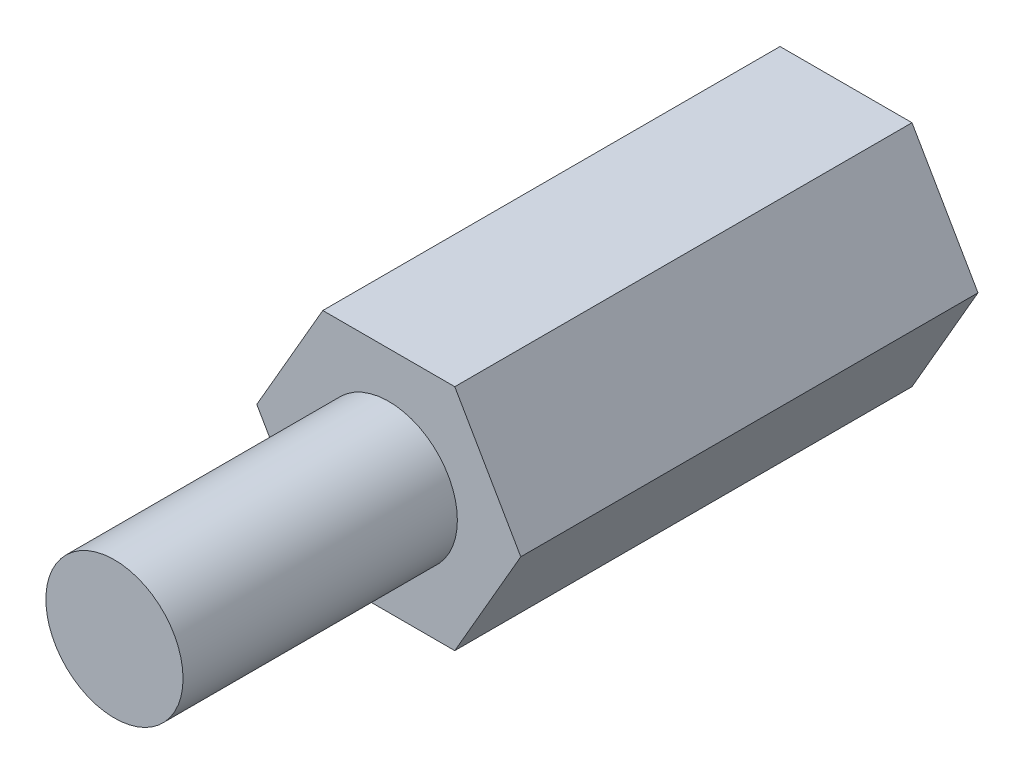
ISO-10303-21;
HEADER;
FILE_DESCRIPTION(('STEP AP214'),'2;1');
FILE_NAME('part.step','',(''),(''),'','','');
FILE_SCHEMA(('AUTOMOTIVE_DESIGN { 1 0 10303 214 1 1 1 1 }'));
ENDSEC;
DATA;
#1=APPLICATION_CONTEXT('core data for automotive mechanical design processes');
#2=APPLICATION_PROTOCOL_DEFINITION('international standard','automotive_design',2000,#1);
#3=PRODUCT_CONTEXT('',#1,'mechanical');
#4=PRODUCT('Part','Part','',(#3));
#5=PRODUCT_RELATED_PRODUCT_CATEGORY('part','',(#4));
#6=PRODUCT_DEFINITION_FORMATION('','',#4);
#7=PRODUCT_DEFINITION_CONTEXT('part definition',#1,'design');
#8=PRODUCT_DEFINITION('design','',#6,#7);
#9=PRODUCT_DEFINITION_SHAPE('','',#8);
#10=(LENGTH_UNIT() NAMED_UNIT(*) SI_UNIT(.MILLI.,.METRE.));
#11=(NAMED_UNIT(*) PLANE_ANGLE_UNIT() SI_UNIT($,.RADIAN.));
#12=(NAMED_UNIT(*) SI_UNIT($,.STERADIAN.) SOLID_ANGLE_UNIT());
#13=UNCERTAINTY_MEASURE_WITH_UNIT(LENGTH_MEASURE(1.E-05),#10,'distance_accuracy_value','');
#14=(GEOMETRIC_REPRESENTATION_CONTEXT(3) GLOBAL_UNCERTAINTY_ASSIGNED_CONTEXT((#13)) GLOBAL_UNIT_ASSIGNED_CONTEXT((#10,
#11,#12)) REPRESENTATION_CONTEXT('',''));
#15=CARTESIAN_POINT('',(0.,0.,0.));
#16=DIRECTION('',(0.,0.,1.));
#17=DIRECTION('',(1.,0.,0.));
#18=AXIS2_PLACEMENT_3D('',#15,#16,#17);
#19=CARTESIAN_POINT('',(1.44337567297407,-2.50000000000001,10.));
#20=DIRECTION('',(0.,0.,1.));
#21=DIRECTION('',(1.,0.,0.));
#22=AXIS2_PLACEMENT_3D('',#19,#20,#21);
#23=PLANE('',#22);
#24=DIRECTION('',(1.,0.,0.));
#25=VECTOR('',#24,1.);
#26=CARTESIAN_POINT('',(-1.44337567297407,-2.5,10.));
#27=LINE('',#26,#25);
#28=CARTESIAN_POINT('',(-1.44337567297407,-2.5,10.));
#29=VERTEX_POINT('',#28);
#30=CARTESIAN_POINT('',(1.44337567297406,-2.50000000000001,10.));
#31=VERTEX_POINT('',#30);
#32=EDGE_CURVE('E133',#29,#31,#27,.T.);
#33=ORIENTED_EDGE('',*,*,#32,.T.);
#34=DIRECTION('',(0.499999999999999,0.866025403784439,0.));
#35=VECTOR('',#34,1.);
#36=CARTESIAN_POINT('',(1.44337567297406,-2.50000000000001,10.));
#37=LINE('',#36,#35);
#38=CARTESIAN_POINT('',(2.88675134594814,0.,10.));
#39=VERTEX_POINT('',#38);
#40=EDGE_CURVE('E90',#31,#39,#37,.T.);
#41=ORIENTED_EDGE('',*,*,#40,.T.);
#42=DIRECTION('',(-0.5,0.866025403784439,0.));
#43=VECTOR('',#42,1.);
#44=CARTESIAN_POINT('',(2.88675134594814,0.,10.));
#45=LINE('',#44,#43);
#46=CARTESIAN_POINT('',(1.44337567297407,2.50000000000002,10.));
#47=VERTEX_POINT('',#46);
#48=EDGE_CURVE('E104',#39,#47,#45,.T.);
#49=ORIENTED_EDGE('',*,*,#48,.T.);
#50=DIRECTION('',(-1.,0.,0.));
#51=VECTOR('',#50,1.);
#52=CARTESIAN_POINT('',(1.44337567297407,2.50000000000002,10.));
#53=LINE('',#52,#51);
#54=CARTESIAN_POINT('',(-1.44337567297407,2.50000000000002,10.));
#55=VERTEX_POINT('',#54);
#56=EDGE_CURVE('E98',#47,#55,#53,.T.);
#57=ORIENTED_EDGE('',*,*,#56,.T.);
#58=DIRECTION('',(-0.500000000000001,-0.866025403784438,0.));
#59=VECTOR('',#58,1.);
#60=CARTESIAN_POINT('',(-1.44337567297407,2.50000000000002,10.));
#61=LINE('',#60,#59);
#62=CARTESIAN_POINT('',(-2.88675134594814,0.,10.));
#63=VERTEX_POINT('',#62);
#64=EDGE_CURVE('E102',#55,#63,#61,.T.);
#65=ORIENTED_EDGE('',*,*,#64,.T.);
#66=DIRECTION('',(0.5,-0.866025403784439,0.));
#67=VECTOR('',#66,1.);
#68=CARTESIAN_POINT('',(-2.88675134594814,0.,10.));
#69=LINE('',#68,#67);
#70=EDGE_CURVE('E52',#63,#29,#69,.T.);
#71=ORIENTED_EDGE('',*,*,#70,.T.);
#72=EDGE_LOOP('',(#33,#41,#49,#57,#65,#71));
#73=FACE_BOUND('',#72,.T.);
#74=CARTESIAN_POINT('',(0.,0.,10.));
#75=DIRECTION('',(0.,0.,1.));
#76=DIRECTION('',(1.,0.,0.));
#77=AXIS2_PLACEMENT_3D('',#74,#75,#76);
#78=CIRCLE('',#77,1.5);
#79=CARTESIAN_POINT('',(1.5,0.,10.));
#80=VERTEX_POINT('',#79);
#81=EDGE_CURVE('E188',#80,#80,#78,.T.);
#82=ORIENTED_EDGE('',*,*,#81,.F.);
#83=EDGE_LOOP('',(#82));
#84=FACE_BOUND('',#83,.T.);
#85=ADVANCED_FACE('F35',(#73,#84),#23,.T.);
#86=CARTESIAN_POINT('',(-1.44337567297407,-2.5,10.));
#87=DIRECTION('',(0.,1.,0.));
#88=DIRECTION('',(-1.,0.,0.));
#89=AXIS2_PLACEMENT_3D('',#86,#87,#88);
#90=PLANE('',#89);
#91=DIRECTION('',(1.,0.,0.));
#92=VECTOR('',#91,1.);
#93=CARTESIAN_POINT('',(-1.44337567297407,-2.5,0.));
#94=LINE('',#93,#92);
#95=CARTESIAN_POINT('',(-1.44337567297407,-2.5,0.));
#96=VERTEX_POINT('',#95);
#97=CARTESIAN_POINT('',(1.44337567297406,-2.50000000000001,0.));
#98=VERTEX_POINT('',#97);
#99=EDGE_CURVE('E122',#96,#98,#94,.T.);
#100=ORIENTED_EDGE('',*,*,#99,.T.);
#101=DIRECTION('',(0.,0.,-1.));
#102=VECTOR('',#101,1.);
#103=CARTESIAN_POINT('',(1.44337567297406,-2.50000000000001,10.));
#104=LINE('',#103,#102);
#105=EDGE_CURVE('E11',#31,#98,#104,.T.);
#106=ORIENTED_EDGE('',*,*,#105,.F.);
#107=ORIENTED_EDGE('',*,*,#32,.F.);
#108=DIRECTION('',(0.,0.,-1.));
#109=VECTOR('',#108,1.);
#110=CARTESIAN_POINT('',(-1.44337567297407,-2.5,10.));
#111=LINE('',#110,#109);
#112=EDGE_CURVE('E118',#29,#96,#111,.T.);
#113=ORIENTED_EDGE('',*,*,#112,.T.);
#114=EDGE_LOOP('',(#100,#106,#107,#113));
#115=FACE_BOUND('',#114,.T.);
#116=ADVANCED_FACE('F37',(#115),#90,.F.);
#117=CARTESIAN_POINT('',(1.44337567297406,-2.50000000000001,10.));
#118=DIRECTION('',(-0.866025403784439,0.499999999999999,0.));
#119=DIRECTION('',(-0.499999999999999,-0.866025403784439,0.));
#120=AXIS2_PLACEMENT_3D('',#117,#118,#119);
#121=PLANE('',#120);
#122=DIRECTION('',(0.499999999999999,0.866025403784439,0.));
#123=VECTOR('',#122,1.);
#124=CARTESIAN_POINT('',(1.44337567297406,-2.50000000000001,0.));
#125=LINE('',#124,#123);
#126=CARTESIAN_POINT('',(2.88675134594814,0.,0.));
#127=VERTEX_POINT('',#126);
#128=EDGE_CURVE('E125',#98,#127,#125,.T.);
#129=ORIENTED_EDGE('',*,*,#128,.T.);
#130=DIRECTION('',(0.,0.,-1.));
#131=VECTOR('',#130,1.);
#132=CARTESIAN_POINT('',(2.88675134594814,0.,10.));
#133=LINE('',#132,#131);
#134=EDGE_CURVE('E44',#39,#127,#133,.T.);
#135=ORIENTED_EDGE('',*,*,#134,.F.);
#136=ORIENTED_EDGE('',*,*,#40,.F.);
#137=ORIENTED_EDGE('',*,*,#105,.T.);
#138=EDGE_LOOP('',(#129,#135,#136,#137));
#139=FACE_BOUND('',#138,.T.);
#140=ADVANCED_FACE('F162',(#139),#121,.F.);
#141=CARTESIAN_POINT('',(2.88675134594814,0.,10.));
#142=DIRECTION('',(-0.866025403784439,-0.5,0.));
#143=DIRECTION('',(0.5,-0.866025403784439,0.));
#144=AXIS2_PLACEMENT_3D('',#141,#142,#143);
#145=PLANE('',#144);
#146=DIRECTION('',(-0.5,0.866025403784439,0.));
#147=VECTOR('',#146,1.);
#148=CARTESIAN_POINT('',(2.88675134594814,0.,0.));
#149=LINE('',#148,#147);
#150=CARTESIAN_POINT('',(1.44337567297407,2.50000000000002,0.));
#151=VERTEX_POINT('',#150);
#152=EDGE_CURVE('E128',#127,#151,#149,.T.);
#153=ORIENTED_EDGE('',*,*,#152,.T.);
#154=DIRECTION('',(0.,0.,-1.));
#155=VECTOR('',#154,1.);
#156=CARTESIAN_POINT('',(1.44337567297407,2.50000000000002,10.));
#157=LINE('',#156,#155);
#158=EDGE_CURVE('E113',#47,#151,#157,.T.);
#159=ORIENTED_EDGE('',*,*,#158,.F.);
#160=ORIENTED_EDGE('',*,*,#48,.F.);
#161=ORIENTED_EDGE('',*,*,#134,.T.);
#162=EDGE_LOOP('',(#153,#159,#160,#161));
#163=FACE_BOUND('',#162,.T.);
#164=ADVANCED_FACE('F139',(#163),#145,.F.);
#165=CARTESIAN_POINT('',(1.44337567297407,2.50000000000002,10.));
#166=DIRECTION('',(0.,-1.,0.));
#167=DIRECTION('',(1.,0.,0.));
#168=AXIS2_PLACEMENT_3D('',#165,#166,#167);
#169=PLANE('',#168);
#170=DIRECTION('',(-1.,0.,0.));
#171=VECTOR('',#170,1.);
#172=CARTESIAN_POINT('',(1.44337567297407,2.50000000000002,0.));
#173=LINE('',#172,#171);
#174=CARTESIAN_POINT('',(-1.44337567297407,2.50000000000002,0.));
#175=VERTEX_POINT('',#174);
#176=EDGE_CURVE('E112',#151,#175,#173,.T.);
#177=ORIENTED_EDGE('',*,*,#176,.T.);
#178=DIRECTION('',(0.,0.,-1.));
#179=VECTOR('',#178,1.);
#180=CARTESIAN_POINT('',(-1.44337567297407,2.50000000000002,10.));
#181=LINE('',#180,#179);
#182=EDGE_CURVE('E109',#55,#175,#181,.T.);
#183=ORIENTED_EDGE('',*,*,#182,.F.);
#184=ORIENTED_EDGE('',*,*,#56,.F.);
#185=ORIENTED_EDGE('',*,*,#158,.T.);
#186=EDGE_LOOP('',(#177,#183,#184,#185));
#187=FACE_BOUND('',#186,.T.);
#188=ADVANCED_FACE('F110',(#187),#169,.F.);
#189=CARTESIAN_POINT('',(-1.44337567297407,2.50000000000002,10.));
#190=DIRECTION('',(0.866025403784438,-0.500000000000001,0.));
#191=DIRECTION('',(0.500000000000001,0.866025403784438,0.));
#192=AXIS2_PLACEMENT_3D('',#189,#190,#191);
#193=PLANE('',#192);
#194=DIRECTION('',(-0.500000000000001,-0.866025403784438,0.));
#195=VECTOR('',#194,1.);
#196=CARTESIAN_POINT('',(-1.44337567297407,2.50000000000002,0.));
#197=LINE('',#196,#195);
#198=CARTESIAN_POINT('',(-2.88675134594814,0.,0.));
#199=VERTEX_POINT('',#198);
#200=EDGE_CURVE('E76',#175,#199,#197,.T.);
#201=ORIENTED_EDGE('',*,*,#200,.T.);
#202=DIRECTION('',(0.,0.,-1.));
#203=VECTOR('',#202,1.);
#204=CARTESIAN_POINT('',(-2.88675134594814,0.,10.));
#205=LINE('',#204,#203);
#206=EDGE_CURVE('E114',#63,#199,#205,.T.);
#207=ORIENTED_EDGE('',*,*,#206,.F.);
#208=ORIENTED_EDGE('',*,*,#64,.F.);
#209=ORIENTED_EDGE('',*,*,#182,.T.);
#210=EDGE_LOOP('',(#201,#207,#208,#209));
#211=FACE_BOUND('',#210,.T.);
#212=ADVANCED_FACE('F116',(#211),#193,.F.);
#213=CARTESIAN_POINT('',(-2.88675134594814,0.,10.));
#214=DIRECTION('',(0.866025403784439,0.5,0.));
#215=DIRECTION('',(-0.5,0.866025403784439,0.));
#216=AXIS2_PLACEMENT_3D('',#213,#214,#215);
#217=PLANE('',#216);
#218=DIRECTION('',(0.5,-0.866025403784439,0.));
#219=VECTOR('',#218,1.);
#220=CARTESIAN_POINT('',(-2.88675134594814,0.,0.));
#221=LINE('',#220,#219);
#222=EDGE_CURVE('E82',#199,#96,#221,.T.);
#223=ORIENTED_EDGE('',*,*,#222,.T.);
#224=ORIENTED_EDGE('',*,*,#112,.F.);
#225=ORIENTED_EDGE('',*,*,#70,.F.);
#226=ORIENTED_EDGE('',*,*,#206,.T.);
#227=EDGE_LOOP('',(#223,#224,#225,#226));
#228=FACE_BOUND('',#227,.T.);
#229=ADVANCED_FACE('F146',(#228),#217,.F.);
#230=CARTESIAN_POINT('',(1.44337567297407,-2.50000000000001,0.));
#231=DIRECTION('',(0.,0.,1.));
#232=DIRECTION('',(1.,0.,0.));
#233=AXIS2_PLACEMENT_3D('',#230,#231,#232);
#234=PLANE('',#233);
#235=CARTESIAN_POINT('',(0.,0.,0.));
#236=DIRECTION('',(0.,0.,-1.));
#237=DIRECTION('',(-1.,0.,0.));
#238=AXIS2_PLACEMENT_3D('',#235,#236,#237);
#239=CIRCLE('',#238,1.24999999999999);
#240=CARTESIAN_POINT('',(-1.24999999999999,0.,0.));
#241=VERTEX_POINT('',#240);
#242=EDGE_CURVE('E185',#241,#241,#239,.T.);
#243=ORIENTED_EDGE('',*,*,#242,.F.);
#244=EDGE_LOOP('',(#243));
#245=FACE_BOUND('',#244,.T.);
#246=ORIENTED_EDGE('',*,*,#99,.F.);
#247=ORIENTED_EDGE('',*,*,#222,.F.);
#248=ORIENTED_EDGE('',*,*,#200,.F.);
#249=ORIENTED_EDGE('',*,*,#176,.F.);
#250=ORIENTED_EDGE('',*,*,#152,.F.);
#251=ORIENTED_EDGE('',*,*,#128,.F.);
#252=EDGE_LOOP('',(#246,#247,#248,#249,#250,#251));
#253=FACE_BOUND('',#252,.T.);
#254=ADVANCED_FACE('F142',(#245,#253),#234,.F.);
#255=CARTESIAN_POINT('',(0.,0.,16.));
#256=DIRECTION('',(0.,0.,-1.));
#257=DIRECTION('',(-1.,0.,0.));
#258=AXIS2_PLACEMENT_3D('',#255,#256,#257);
#259=CYLINDRICAL_SURFACE('',#258,1.5);
#260=CARTESIAN_POINT('',(0.,0.,16.));
#261=DIRECTION('',(0.,0.,1.));
#262=DIRECTION('',(1.,0.,0.));
#263=AXIS2_PLACEMENT_3D('',#260,#261,#262);
#264=CIRCLE('',#263,1.5);
#265=CARTESIAN_POINT('',(1.5,0.,16.));
#266=VERTEX_POINT('',#265);
#267=EDGE_CURVE('E126',#266,#266,#264,.T.);
#268=ORIENTED_EDGE('',*,*,#267,.F.);
#269=EDGE_LOOP('',(#268));
#270=FACE_BOUND('',#269,.T.);
#271=ORIENTED_EDGE('',*,*,#81,.T.);
#272=EDGE_LOOP('',(#271));
#273=FACE_BOUND('',#272,.T.);
#274=ADVANCED_FACE('F153',(#270,#273),#259,.T.);
#275=CARTESIAN_POINT('',(0.,0.,16.));
#276=DIRECTION('',(0.,0.,1.));
#277=DIRECTION('',(1.,0.,0.));
#278=AXIS2_PLACEMENT_3D('',#275,#276,#277);
#279=PLANE('',#278);
#280=ORIENTED_EDGE('',*,*,#267,.T.);
#281=EDGE_LOOP('',(#280));
#282=FACE_BOUND('',#281,.T.);
#283=ADVANCED_FACE('F166',(#282),#279,.T.);
#284=CARTESIAN_POINT('',(0.,0.,0.));
#285=DIRECTION('',(0.,0.,-1.));
#286=DIRECTION('',(-1.,0.,0.));
#287=AXIS2_PLACEMENT_3D('',#284,#285,#286);
#288=CYLINDRICAL_SURFACE('',#287,1.24999999999999);
#289=CARTESIAN_POINT('',(0.,0.,6.5));
#290=DIRECTION('',(0.,0.,-1.));
#291=DIRECTION('',(-1.,0.,0.));
#292=AXIS2_PLACEMENT_3D('',#289,#290,#291);
#293=CIRCLE('',#292,1.25);
#294=CARTESIAN_POINT('',(-1.25,0.,6.5));
#295=VERTEX_POINT('',#294);
#296=EDGE_CURVE('E184',#295,#295,#293,.T.);
#297=ORIENTED_EDGE('',*,*,#296,.F.);
#298=EDGE_LOOP('',(#297));
#299=FACE_BOUND('',#298,.T.);
#300=ORIENTED_EDGE('',*,*,#242,.T.);
#301=EDGE_LOOP('',(#300));
#302=FACE_BOUND('',#301,.T.);
#303=ADVANCED_FACE('F170',(#299,#302),#288,.F.);
#304=CARTESIAN_POINT('',(0.,0.,6.5));
#305=DIRECTION('',(0.,0.,-1.));
#306=DIRECTION('',(-1.,0.,0.));
#307=AXIS2_PLACEMENT_3D('',#304,#305,#306);
#308=CONICAL_SURFACE('',#307,1.25,1.02974425867665);
#309=CARTESIAN_POINT('',(0.,0.,7.25107577378445));
#310=VERTEX_POINT('',#309);
#311=VERTEX_LOOP('',#310);
#312=FACE_BOUND('',#311,.T.);
#313=ORIENTED_EDGE('',*,*,#296,.T.);
#314=EDGE_LOOP('',(#313));
#315=FACE_BOUND('',#314,.T.);
#316=ADVANCED_FACE('F174',(#312,#315),#308,.F.);
#317=CLOSED_SHELL('',(#85,#116,#140,#164,#188,#212,#229,#254,#274,#283,#303,#316));
#318=MANIFOLD_SOLID_BREP('B2',#317);
#319=ADVANCED_BREP_SHAPE_REPRESENTATION('',(#18,#318),#14);
#320=SHAPE_DEFINITION_REPRESENTATION(#9,#319);
ENDSEC;
END-ISO-10303-21;
